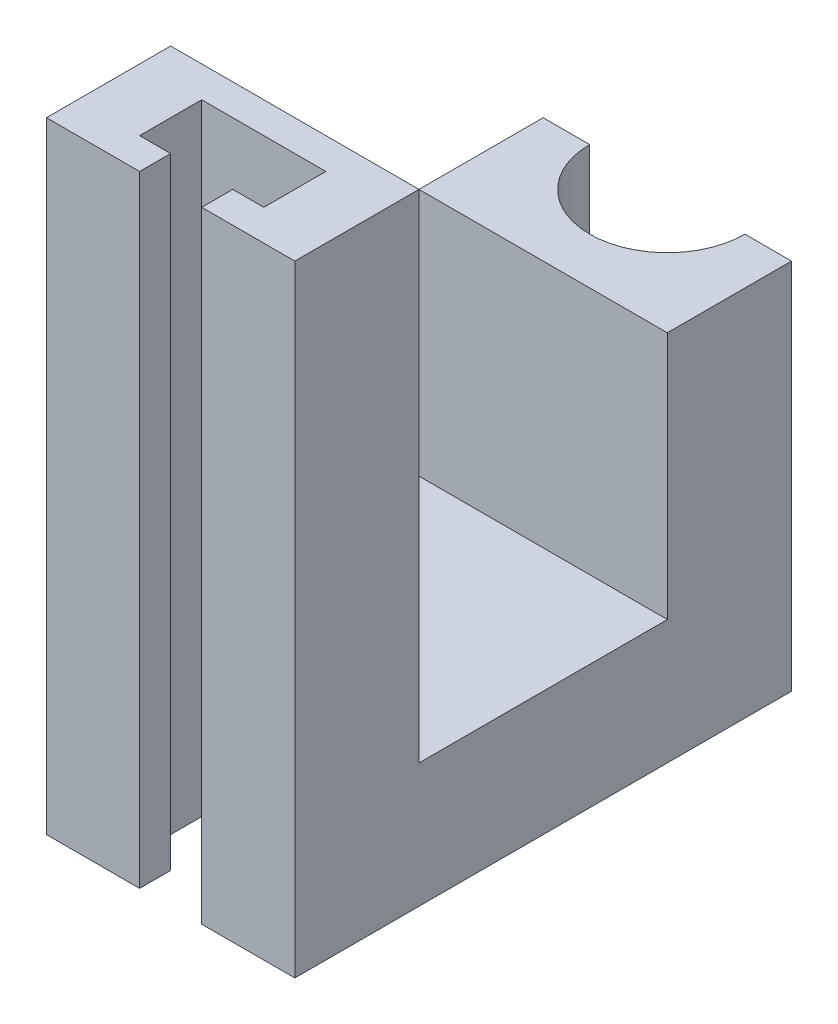
ISO-10303-21;
HEADER;
FILE_DESCRIPTION(('STEP AP214'),'2;1');
FILE_NAME('part.step','',(''),(''),'','','');
FILE_SCHEMA(('AUTOMOTIVE_DESIGN { 1 0 10303 214 1 1 1 1 }'));
ENDSEC;
DATA;
#1=APPLICATION_CONTEXT('core data for automotive mechanical design processes');
#2=APPLICATION_PROTOCOL_DEFINITION('international standard','automotive_design',2000,#1);
#3=PRODUCT_CONTEXT('',#1,'mechanical');
#4=PRODUCT('Part','Part','',(#3));
#5=PRODUCT_RELATED_PRODUCT_CATEGORY('part','',(#4));
#6=PRODUCT_DEFINITION_FORMATION('','',#4);
#7=PRODUCT_DEFINITION_CONTEXT('part definition',#1,'design');
#8=PRODUCT_DEFINITION('design','',#6,#7);
#9=PRODUCT_DEFINITION_SHAPE('','',#8);
#10=(LENGTH_UNIT() NAMED_UNIT(*) SI_UNIT(.MILLI.,.METRE.));
#11=(NAMED_UNIT(*) PLANE_ANGLE_UNIT() SI_UNIT($,.RADIAN.));
#12=(NAMED_UNIT(*) SI_UNIT($,.STERADIAN.) SOLID_ANGLE_UNIT());
#13=UNCERTAINTY_MEASURE_WITH_UNIT(LENGTH_MEASURE(1.E-05),#10,'distance_accuracy_value','');
#14=(GEOMETRIC_REPRESENTATION_CONTEXT(3) GLOBAL_UNCERTAINTY_ASSIGNED_CONTEXT((#13)) GLOBAL_UNIT_ASSIGNED_CONTEXT((#10,
#11,#12)) REPRESENTATION_CONTEXT('',''));
#15=CARTESIAN_POINT('',(0.,0.,0.));
#16=DIRECTION('',(0.,0.,1.));
#17=DIRECTION('',(1.,0.,0.));
#18=AXIS2_PLACEMENT_3D('',#15,#16,#17);
#19=CARTESIAN_POINT('',(0.,100.,0.));
#20=DIRECTION('',(0.,1.,0.));
#21=DIRECTION('',(0.,0.,1.));
#22=AXIS2_PLACEMENT_3D('',#19,#20,#21);
#23=PLANE('',#22);
#24=DIRECTION('',(-1.,0.,0.));
#25=VECTOR('',#24,1.);
#26=CARTESIAN_POINT('',(26.6601873028341,100.,-20.7151911646467));
#27=LINE('',#26,#25);
#28=CARTESIAN_POINT('',(26.6591873028341,100.,-20.7151911646467));
#29=VERTEX_POINT('',#28);
#30=CARTESIAN_POINT('',(-13.3408126971659,100.,-20.7151911646467));
#31=VERTEX_POINT('',#30);
#32=EDGE_CURVE('E286',#29,#31,#27,.T.);
#33=ORIENTED_EDGE('',*,*,#32,.T.);
#34=DIRECTION('',(0.,0.,-1.));
#35=VECTOR('',#34,1.);
#36=CARTESIAN_POINT('',(-13.3408126971659,100.,0.));
#37=LINE('',#36,#35);
#38=CARTESIAN_POINT('',(-13.3408126971659,100.,-0.715191164646745));
#39=VERTEX_POINT('',#38);
#40=EDGE_CURVE('E255',#39,#31,#37,.T.);
#41=ORIENTED_EDGE('',*,*,#40,.F.);
#42=DIRECTION('',(1.,0.,0.));
#43=VECTOR('',#42,1.);
#44=CARTESIAN_POINT('',(0.,100.,-0.715191164646745));
#45=LINE('',#44,#43);
#46=CARTESIAN_POINT('',(1.65918730283408,100.,-0.715191164646745));
#47=VERTEX_POINT('',#46);
#48=EDGE_CURVE('E172',#39,#47,#45,.T.);
#49=ORIENTED_EDGE('',*,*,#48,.T.);
#50=DIRECTION('',(0.,0.,-1.));
#51=VECTOR('',#50,1.);
#52=CARTESIAN_POINT('',(1.65918730283408,100.,0.));
#53=LINE('',#52,#51);
#54=CARTESIAN_POINT('',(1.65918730283408,100.,-5.71519116464675));
#55=VERTEX_POINT('',#54);
#56=EDGE_CURVE('E249',#47,#55,#53,.T.);
#57=ORIENTED_EDGE('',*,*,#56,.T.);
#58=DIRECTION('',(-1.,0.,0.));
#59=VECTOR('',#58,1.);
#60=CARTESIAN_POINT('',(0.,100.,-5.71519116464675));
#61=LINE('',#60,#59);
#62=CARTESIAN_POINT('',(-3.34081269716592,100.,-5.71519116464674));
#63=VERTEX_POINT('',#62);
#64=EDGE_CURVE('E251',#55,#63,#61,.T.);
#65=ORIENTED_EDGE('',*,*,#64,.T.);
#66=DIRECTION('',(0.,0.,-1.));
#67=VECTOR('',#66,1.);
#68=CARTESIAN_POINT('',(-3.34081269716592,100.,0.));
#69=LINE('',#68,#67);
#70=CARTESIAN_POINT('',(-3.34081269716592,100.,-15.7151911646467));
#71=VERTEX_POINT('',#70);
#72=EDGE_CURVE('E253',#63,#71,#69,.T.);
#73=ORIENTED_EDGE('',*,*,#72,.T.);
#74=DIRECTION('',(1.,0.,0.));
#75=VECTOR('',#74,1.);
#76=CARTESIAN_POINT('',(0.,100.,-15.7151911646467));
#77=LINE('',#76,#75);
#78=CARTESIAN_POINT('',(16.6591873028341,100.,-15.7151911646467));
#79=VERTEX_POINT('',#78);
#80=EDGE_CURVE('E259',#71,#79,#77,.T.);
#81=ORIENTED_EDGE('',*,*,#80,.T.);
#82=DIRECTION('',(0.,0.,1.));
#83=VECTOR('',#82,1.);
#84=CARTESIAN_POINT('',(16.6591873028341,100.,0.));
#85=LINE('',#84,#83);
#86=CARTESIAN_POINT('',(16.6591873028341,100.,-5.71519116464674));
#87=VERTEX_POINT('',#86);
#88=EDGE_CURVE('E152',#79,#87,#85,.T.);
#89=ORIENTED_EDGE('',*,*,#88,.T.);
#90=DIRECTION('',(-1.,0.,0.));
#91=VECTOR('',#90,1.);
#92=CARTESIAN_POINT('',(0.,100.,-5.71519116464674));
#93=LINE('',#92,#91);
#94=CARTESIAN_POINT('',(11.6591873028341,100.,-5.71519116464674));
#95=VERTEX_POINT('',#94);
#96=EDGE_CURVE('E145',#87,#95,#93,.T.);
#97=ORIENTED_EDGE('',*,*,#96,.T.);
#98=DIRECTION('',(0.,0.,1.));
#99=VECTOR('',#98,1.);
#100=CARTESIAN_POINT('',(11.6591873028341,100.,0.));
#101=LINE('',#100,#99);
#102=CARTESIAN_POINT('',(11.6591873028341,100.,-0.715191164646745));
#103=VERTEX_POINT('',#102);
#104=EDGE_CURVE('E149',#95,#103,#101,.T.);
#105=ORIENTED_EDGE('',*,*,#104,.T.);
#106=CARTESIAN_POINT('',(26.6591873028341,100.,-0.715191164646745));
#107=VERTEX_POINT('',#106);
#108=EDGE_CURVE('E63',#103,#107,#45,.T.);
#109=ORIENTED_EDGE('',*,*,#108,.T.);
#110=DIRECTION('',(0.,0.,-1.));
#111=VECTOR('',#110,1.);
#112=CARTESIAN_POINT('',(26.6591873028341,100.,0.));
#113=LINE('',#112,#111);
#114=EDGE_CURVE('E170',#107,#29,#113,.T.);
#115=ORIENTED_EDGE('',*,*,#114,.T.);
#116=EDGE_LOOP('',(#33,#41,#49,#57,#65,#73,#81,#89,#97,#105,#109,#115));
#117=FACE_BOUND('',#116,.T.);
#118=ADVANCED_FACE('F39',(#117),#23,.T.);
#119=CARTESIAN_POINT('',(6.65918730283408,100.,-80.7151911646467));
#120=DIRECTION('',(0.,-1.,0.));
#121=DIRECTION('',(0.,0.,-1.));
#122=AXIS2_PLACEMENT_3D('',#119,#120,#121);
#123=CYLINDRICAL_SURFACE('',#122,12.5);
#124=CARTESIAN_POINT('',(6.65918730283408,60.,-80.7151911646467));
#125=DIRECTION('',(0.,-1.,0.));
#126=DIRECTION('',(0.,0.,-1.));
#127=AXIS2_PLACEMENT_3D('',#124,#125,#126);
#128=CIRCLE('',#127,12.5);
#129=CARTESIAN_POINT('',(-5.84081269716591,60.,-80.7151911646467));
#130=VERTEX_POINT('',#129);
#131=CARTESIAN_POINT('',(19.1591873028341,60.,-80.7151911646467));
#132=VERTEX_POINT('',#131);
#133=EDGE_CURVE('E324',#130,#132,#128,.F.);
#134=ORIENTED_EDGE('',*,*,#133,.T.);
#135=DIRECTION('',(0.,-1.,0.));
#136=VECTOR('',#135,1.);
#137=CARTESIAN_POINT('',(19.1591873028341,100.,-80.7151911646467));
#138=LINE('',#137,#136);
#139=CARTESIAN_POINT('',(19.1591873028341,0.,-80.7151911646467));
#140=VERTEX_POINT('',#139);
#141=EDGE_CURVE('E114',#132,#140,#138,.T.);
#142=ORIENTED_EDGE('',*,*,#141,.T.);
#143=CARTESIAN_POINT('',(6.65918730283408,0.,-80.7151911646467));
#144=DIRECTION('',(0.,1.,0.));
#145=DIRECTION('',(0.,0.,1.));
#146=AXIS2_PLACEMENT_3D('',#143,#144,#145);
#147=CIRCLE('',#146,12.5);
#148=CARTESIAN_POINT('',(-5.84081269716591,0.,-80.7151911646467));
#149=VERTEX_POINT('',#148);
#150=EDGE_CURVE('E176',#149,#140,#147,.T.);
#151=ORIENTED_EDGE('',*,*,#150,.F.);
#152=DIRECTION('',(0.,-1.,0.));
#153=VECTOR('',#152,1.);
#154=CARTESIAN_POINT('',(-5.84081269716591,100.,-80.7151911646467));
#155=LINE('',#154,#153);
#156=EDGE_CURVE('E11',#130,#149,#155,.T.);
#157=ORIENTED_EDGE('',*,*,#156,.F.);
#158=EDGE_LOOP('',(#134,#142,#151,#157));
#159=FACE_BOUND('',#158,.T.);
#160=ADVANCED_FACE('F41',(#159),#123,.F.);
#161=CARTESIAN_POINT('',(0.,100.,-80.7151911646467));
#162=DIRECTION('',(0.,0.,-1.));
#163=DIRECTION('',(-1.,0.,0.));
#164=AXIS2_PLACEMENT_3D('',#161,#162,#163);
#165=PLANE('',#164);
#166=DIRECTION('',(-1.,0.,0.));
#167=VECTOR('',#166,1.);
#168=CARTESIAN_POINT('',(26.6601873028341,60.,-80.7151911646467));
#169=LINE('',#168,#167);
#170=CARTESIAN_POINT('',(-13.3408126971659,60.,-80.7151911646467));
#171=VERTEX_POINT('',#170);
#172=EDGE_CURVE('E350',#130,#171,#169,.T.);
#173=ORIENTED_EDGE('',*,*,#172,.F.);
#174=ORIENTED_EDGE('',*,*,#156,.T.);
#175=DIRECTION('',(1.,0.,0.));
#176=VECTOR('',#175,1.);
#177=CARTESIAN_POINT('',(0.,0.,-80.7151911646467));
#178=LINE('',#177,#176);
#179=CARTESIAN_POINT('',(-13.3408126971659,0.,-80.7151911646467));
#180=VERTEX_POINT('',#179);
#181=EDGE_CURVE('E178',#180,#149,#178,.T.);
#182=ORIENTED_EDGE('',*,*,#181,.F.);
#183=DIRECTION('',(0.,-1.,0.));
#184=VECTOR('',#183,1.);
#185=CARTESIAN_POINT('',(-13.3408126971659,100.,-80.7151911646467));
#186=LINE('',#185,#184);
#187=EDGE_CURVE('E47',#171,#180,#186,.T.);
#188=ORIENTED_EDGE('',*,*,#187,.F.);
#189=EDGE_LOOP('',(#173,#174,#182,#188));
#190=FACE_BOUND('',#189,.T.);
#191=ADVANCED_FACE('F235',(#190),#165,.T.);
#192=CARTESIAN_POINT('',(-13.3408126971659,100.,0.));
#193=DIRECTION('',(-1.,0.,0.));
#194=DIRECTION('',(0.,0.,1.));
#195=AXIS2_PLACEMENT_3D('',#192,#193,#194);
#196=PLANE('',#195);
#197=DIRECTION('',(0.,0.,1.));
#198=VECTOR('',#197,1.);
#199=CARTESIAN_POINT('',(-13.3408126971659,60.,0.));
#200=LINE('',#199,#198);
#201=CARTESIAN_POINT('',(-13.3408126971659,60.,-60.7151911646468));
#202=VERTEX_POINT('',#201);
#203=EDGE_CURVE('E54',#171,#202,#200,.T.);
#204=ORIENTED_EDGE('',*,*,#203,.F.);
#205=ORIENTED_EDGE('',*,*,#187,.T.);
#206=DIRECTION('',(0.,0.,-1.));
#207=VECTOR('',#206,1.);
#208=CARTESIAN_POINT('',(-13.3408126971659,0.,0.));
#209=LINE('',#208,#207);
#210=CARTESIAN_POINT('',(-13.3408126971659,0.,-0.715191164646745));
#211=VERTEX_POINT('',#210);
#212=EDGE_CURVE('E182',#211,#180,#209,.T.);
#213=ORIENTED_EDGE('',*,*,#212,.F.);
#214=DIRECTION('',(0.,-1.,0.));
#215=VECTOR('',#214,1.);
#216=CARTESIAN_POINT('',(-13.3408126971659,100.,-0.715191164646745));
#217=LINE('',#216,#215);
#218=EDGE_CURVE('E122',#39,#211,#217,.T.);
#219=ORIENTED_EDGE('',*,*,#218,.F.);
#220=ORIENTED_EDGE('',*,*,#40,.T.);
#221=DIRECTION('',(0.,1.,0.));
#222=VECTOR('',#221,1.);
#223=CARTESIAN_POINT('',(-13.3408126971659,20.,-20.7151911646467));
#224=LINE('',#223,#222);
#225=CARTESIAN_POINT('',(-13.3408126971659,20.,-20.7151911646467));
#226=VERTEX_POINT('',#225);
#227=EDGE_CURVE('E319',#226,#31,#224,.T.);
#228=ORIENTED_EDGE('',*,*,#227,.F.);
#229=DIRECTION('',(0.,0.,1.));
#230=VECTOR('',#229,1.);
#231=CARTESIAN_POINT('',(-13.3408126971659,20.,-60.7151911646467));
#232=LINE('',#231,#230);
#233=CARTESIAN_POINT('',(-13.3408126971659,20.,-60.7151911646467));
#234=VERTEX_POINT('',#233);
#235=EDGE_CURVE('E315',#234,#226,#232,.T.);
#236=ORIENTED_EDGE('',*,*,#235,.F.);
#237=DIRECTION('',(0.,-1.,0.));
#238=VECTOR('',#237,1.);
#239=CARTESIAN_POINT('',(-13.3408126971659,100.,-60.7151911646468));
#240=LINE('',#239,#238);
#241=EDGE_CURVE('E329',#202,#234,#240,.T.);
#242=ORIENTED_EDGE('',*,*,#241,.F.);
#243=EDGE_LOOP('',(#204,#205,#213,#219,#220,#228,#236,#242));
#244=FACE_BOUND('',#243,.T.);
#245=ADVANCED_FACE('F230',(#244),#196,.T.);
#246=CARTESIAN_POINT('',(0.,100.,-0.715191164646745));
#247=DIRECTION('',(0.,0.,-1.));
#248=DIRECTION('',(-1.,0.,0.));
#249=AXIS2_PLACEMENT_3D('',#246,#247,#248);
#250=PLANE('',#249);
#251=DIRECTION('',(1.,0.,0.));
#252=VECTOR('',#251,1.);
#253=CARTESIAN_POINT('',(0.,0.,-0.715191164646745));
#254=LINE('',#253,#252);
#255=CARTESIAN_POINT('',(1.65918730283408,0.,-0.715191164646745));
#256=VERTEX_POINT('',#255);
#257=EDGE_CURVE('E186',#211,#256,#254,.T.);
#258=ORIENTED_EDGE('',*,*,#257,.T.);
#259=DIRECTION('',(0.,-1.,0.));
#260=VECTOR('',#259,1.);
#261=CARTESIAN_POINT('',(1.65918730283408,100.,-0.715191164646745));
#262=LINE('',#261,#260);
#263=EDGE_CURVE('E225',#47,#256,#262,.T.);
#264=ORIENTED_EDGE('',*,*,#263,.F.);
#265=ORIENTED_EDGE('',*,*,#48,.F.);
#266=ORIENTED_EDGE('',*,*,#218,.T.);
#267=EDGE_LOOP('',(#258,#264,#265,#266));
#268=FACE_BOUND('',#267,.T.);
#269=ADVANCED_FACE('F244',(#268),#250,.F.);
#270=CARTESIAN_POINT('',(1.65918730283408,100.,0.));
#271=DIRECTION('',(-1.,0.,0.));
#272=DIRECTION('',(0.,0.,1.));
#273=AXIS2_PLACEMENT_3D('',#270,#271,#272);
#274=PLANE('',#273);
#275=DIRECTION('',(0.,0.,-1.));
#276=VECTOR('',#275,1.);
#277=CARTESIAN_POINT('',(1.65918730283408,0.,0.));
#278=LINE('',#277,#276);
#279=CARTESIAN_POINT('',(1.65918730283408,0.,-5.71519116464675));
#280=VERTEX_POINT('',#279);
#281=EDGE_CURVE('E188',#256,#280,#278,.T.);
#282=ORIENTED_EDGE('',*,*,#281,.T.);
#283=DIRECTION('',(0.,-1.,0.));
#284=VECTOR('',#283,1.);
#285=CARTESIAN_POINT('',(1.65918730283408,100.,-5.71519116464675));
#286=LINE('',#285,#284);
#287=EDGE_CURVE('E222',#55,#280,#286,.T.);
#288=ORIENTED_EDGE('',*,*,#287,.F.);
#289=ORIENTED_EDGE('',*,*,#56,.F.);
#290=ORIENTED_EDGE('',*,*,#263,.T.);
#291=EDGE_LOOP('',(#282,#288,#289,#290));
#292=FACE_BOUND('',#291,.T.);
#293=ADVANCED_FACE('F247',(#292),#274,.F.);
#294=CARTESIAN_POINT('',(0.,100.,-5.71519116464675));
#295=DIRECTION('',(0.,0.,1.));
#296=DIRECTION('',(1.,0.,0.));
#297=AXIS2_PLACEMENT_3D('',#294,#295,#296);
#298=PLANE('',#297);
#299=DIRECTION('',(-1.,0.,0.));
#300=VECTOR('',#299,1.);
#301=CARTESIAN_POINT('',(0.,0.,-5.71519116464675));
#302=LINE('',#301,#300);
#303=CARTESIAN_POINT('',(-3.34081269716592,0.,-5.71519116464674));
#304=VERTEX_POINT('',#303);
#305=EDGE_CURVE('E191',#280,#304,#302,.T.);
#306=ORIENTED_EDGE('',*,*,#305,.T.);
#307=DIRECTION('',(0.,-1.,0.));
#308=VECTOR('',#307,1.);
#309=CARTESIAN_POINT('',(-3.34081269716592,100.,-5.71519116464674));
#310=LINE('',#309,#308);
#311=EDGE_CURVE('E219',#63,#304,#310,.T.);
#312=ORIENTED_EDGE('',*,*,#311,.F.);
#313=ORIENTED_EDGE('',*,*,#64,.F.);
#314=ORIENTED_EDGE('',*,*,#287,.T.);
#315=EDGE_LOOP('',(#306,#312,#313,#314));
#316=FACE_BOUND('',#315,.T.);
#317=ADVANCED_FACE('F390',(#316),#298,.F.);
#318=CARTESIAN_POINT('',(-3.34081269716592,100.,0.));
#319=DIRECTION('',(-1.,0.,0.));
#320=DIRECTION('',(0.,0.,1.));
#321=AXIS2_PLACEMENT_3D('',#318,#319,#320);
#322=PLANE('',#321);
#323=DIRECTION('',(0.,0.,-1.));
#324=VECTOR('',#323,1.);
#325=CARTESIAN_POINT('',(-3.34081269716592,0.,0.));
#326=LINE('',#325,#324);
#327=CARTESIAN_POINT('',(-3.34081269716592,0.,-15.7151911646467));
#328=VERTEX_POINT('',#327);
#329=EDGE_CURVE('E193',#304,#328,#326,.T.);
#330=ORIENTED_EDGE('',*,*,#329,.T.);
#331=DIRECTION('',(0.,-1.,0.));
#332=VECTOR('',#331,1.);
#333=CARTESIAN_POINT('',(-3.34081269716592,100.,-15.7151911646467));
#334=LINE('',#333,#332);
#335=EDGE_CURVE('E216',#71,#328,#334,.T.);
#336=ORIENTED_EDGE('',*,*,#335,.F.);
#337=ORIENTED_EDGE('',*,*,#72,.F.);
#338=ORIENTED_EDGE('',*,*,#311,.T.);
#339=EDGE_LOOP('',(#330,#336,#337,#338));
#340=FACE_BOUND('',#339,.T.);
#341=ADVANCED_FACE('F387',(#340),#322,.F.);
#342=CARTESIAN_POINT('',(0.,100.,-15.7151911646467));
#343=DIRECTION('',(0.,0.,-1.));
#344=DIRECTION('',(-1.,0.,0.));
#345=AXIS2_PLACEMENT_3D('',#342,#343,#344);
#346=PLANE('',#345);
#347=DIRECTION('',(1.,0.,0.));
#348=VECTOR('',#347,1.);
#349=CARTESIAN_POINT('',(0.,0.,-15.7151911646467));
#350=LINE('',#349,#348);
#351=CARTESIAN_POINT('',(16.6591873028341,0.,-15.7151911646467));
#352=VERTEX_POINT('',#351);
#353=EDGE_CURVE('E195',#328,#352,#350,.T.);
#354=ORIENTED_EDGE('',*,*,#353,.T.);
#355=DIRECTION('',(0.,-1.,0.));
#356=VECTOR('',#355,1.);
#357=CARTESIAN_POINT('',(16.6591873028341,100.,-15.7151911646467));
#358=LINE('',#357,#356);
#359=EDGE_CURVE('E213',#79,#352,#358,.T.);
#360=ORIENTED_EDGE('',*,*,#359,.F.);
#361=ORIENTED_EDGE('',*,*,#80,.F.);
#362=ORIENTED_EDGE('',*,*,#335,.T.);
#363=EDGE_LOOP('',(#354,#360,#361,#362));
#364=FACE_BOUND('',#363,.T.);
#365=ADVANCED_FACE('F265',(#364),#346,.F.);
#366=CARTESIAN_POINT('',(16.6591873028341,100.,0.));
#367=DIRECTION('',(1.,0.,0.));
#368=DIRECTION('',(0.,0.,-1.));
#369=AXIS2_PLACEMENT_3D('',#366,#367,#368);
#370=PLANE('',#369);
#371=DIRECTION('',(0.,0.,1.));
#372=VECTOR('',#371,1.);
#373=CARTESIAN_POINT('',(16.6591873028341,0.,0.));
#374=LINE('',#373,#372);
#375=CARTESIAN_POINT('',(16.6591873028341,0.,-5.71519116464674));
#376=VERTEX_POINT('',#375);
#377=EDGE_CURVE('E197',#352,#376,#374,.T.);
#378=ORIENTED_EDGE('',*,*,#377,.T.);
#379=DIRECTION('',(0.,-1.,0.));
#380=VECTOR('',#379,1.);
#381=CARTESIAN_POINT('',(16.6591873028341,100.,-5.71519116464674));
#382=LINE('',#381,#380);
#383=EDGE_CURVE('E164',#87,#376,#382,.T.);
#384=ORIENTED_EDGE('',*,*,#383,.F.);
#385=ORIENTED_EDGE('',*,*,#88,.F.);
#386=ORIENTED_EDGE('',*,*,#359,.T.);
#387=EDGE_LOOP('',(#378,#384,#385,#386));
#388=FACE_BOUND('',#387,.T.);
#389=ADVANCED_FACE('F269',(#388),#370,.F.);
#390=CARTESIAN_POINT('',(0.,100.,-5.71519116464674));
#391=DIRECTION('',(0.,0.,1.));
#392=DIRECTION('',(1.,0.,0.));
#393=AXIS2_PLACEMENT_3D('',#390,#391,#392);
#394=PLANE('',#393);
#395=DIRECTION('',(-1.,0.,0.));
#396=VECTOR('',#395,1.);
#397=CARTESIAN_POINT('',(0.,0.,-5.71519116464674));
#398=LINE('',#397,#396);
#399=CARTESIAN_POINT('',(11.6591873028341,0.,-5.71519116464674));
#400=VERTEX_POINT('',#399);
#401=EDGE_CURVE('E161',#376,#400,#398,.T.);
#402=ORIENTED_EDGE('',*,*,#401,.T.);
#403=DIRECTION('',(0.,-1.,0.));
#404=VECTOR('',#403,1.);
#405=CARTESIAN_POINT('',(11.6591873028341,100.,-5.71519116464674));
#406=LINE('',#405,#404);
#407=EDGE_CURVE('E158',#95,#400,#406,.T.);
#408=ORIENTED_EDGE('',*,*,#407,.F.);
#409=ORIENTED_EDGE('',*,*,#96,.F.);
#410=ORIENTED_EDGE('',*,*,#383,.T.);
#411=EDGE_LOOP('',(#402,#408,#409,#410));
#412=FACE_BOUND('',#411,.T.);
#413=ADVANCED_FACE('F159',(#412),#394,.F.);
#414=CARTESIAN_POINT('',(11.6591873028341,100.,0.));
#415=DIRECTION('',(1.,0.,0.));
#416=DIRECTION('',(0.,0.,-1.));
#417=AXIS2_PLACEMENT_3D('',#414,#415,#416);
#418=PLANE('',#417);
#419=DIRECTION('',(0.,0.,1.));
#420=VECTOR('',#419,1.);
#421=CARTESIAN_POINT('',(11.6591873028341,0.,0.));
#422=LINE('',#421,#420);
#423=CARTESIAN_POINT('',(11.6591873028341,0.,-0.715191164646745));
#424=VERTEX_POINT('',#423);
#425=EDGE_CURVE('E200',#400,#424,#422,.T.);
#426=ORIENTED_EDGE('',*,*,#425,.T.);
#427=DIRECTION('',(0.,-1.,0.));
#428=VECTOR('',#427,1.);
#429=CARTESIAN_POINT('',(11.6591873028341,100.,-0.715191164646745));
#430=LINE('',#429,#428);
#431=EDGE_CURVE('E165',#103,#424,#430,.T.);
#432=ORIENTED_EDGE('',*,*,#431,.F.);
#433=ORIENTED_EDGE('',*,*,#104,.F.);
#434=ORIENTED_EDGE('',*,*,#407,.T.);
#435=EDGE_LOOP('',(#426,#432,#433,#434));
#436=FACE_BOUND('',#435,.T.);
#437=ADVANCED_FACE('F167',(#436),#418,.F.);
#438=CARTESIAN_POINT('',(26.6591873028341,0.,-0.715191164646745));
#439=VERTEX_POINT('',#438);
#440=EDGE_CURVE('E189',#424,#439,#254,.T.);
#441=ORIENTED_EDGE('',*,*,#440,.T.);
#442=DIRECTION('',(0.,-1.,0.));
#443=VECTOR('',#442,1.);
#444=CARTESIAN_POINT('',(26.6591873028341,100.,-0.715191164646745));
#445=LINE('',#444,#443);
#446=EDGE_CURVE('E208',#107,#439,#445,.T.);
#447=ORIENTED_EDGE('',*,*,#446,.F.);
#448=ORIENTED_EDGE('',*,*,#108,.F.);
#449=ORIENTED_EDGE('',*,*,#431,.T.);
#450=EDGE_LOOP('',(#441,#447,#448,#449));
#451=FACE_BOUND('',#450,.T.);
#452=ADVANCED_FACE('F273',(#451),#250,.F.);
#453=CARTESIAN_POINT('',(26.6591873028341,100.,0.));
#454=DIRECTION('',(-1.,0.,0.));
#455=DIRECTION('',(0.,0.,1.));
#456=AXIS2_PLACEMENT_3D('',#453,#454,#455);
#457=PLANE('',#456);
#458=DIRECTION('',(0.,-1.,0.));
#459=VECTOR('',#458,1.);
#460=CARTESIAN_POINT('',(26.6591873028341,100.,-80.7151911646467));
#461=LINE('',#460,#459);
#462=CARTESIAN_POINT('',(26.6591873028341,60.,-80.7151911646467));
#463=VERTEX_POINT('',#462);
#464=CARTESIAN_POINT('',(26.6591873028341,0.,-80.7151911646467));
#465=VERTEX_POINT('',#464);
#466=EDGE_CURVE('E206',#463,#465,#461,.T.);
#467=ORIENTED_EDGE('',*,*,#466,.F.);
#468=DIRECTION('',(0.,0.,-1.));
#469=VECTOR('',#468,1.);
#470=CARTESIAN_POINT('',(26.6591873028341,60.,0.));
#471=LINE('',#470,#469);
#472=CARTESIAN_POINT('',(26.6591873028341,60.,-60.7151911646468));
#473=VERTEX_POINT('',#472);
#474=EDGE_CURVE('E342',#473,#463,#471,.T.);
#475=ORIENTED_EDGE('',*,*,#474,.F.);
#476=DIRECTION('',(0.,1.,0.));
#477=VECTOR('',#476,1.);
#478=CARTESIAN_POINT('',(26.6591873028341,100.,-60.7151911646468));
#479=LINE('',#478,#477);
#480=CARTESIAN_POINT('',(26.6591873028341,20.,-60.7151911646467));
#481=VERTEX_POINT('',#480);
#482=EDGE_CURVE('E322',#481,#473,#479,.T.);
#483=ORIENTED_EDGE('',*,*,#482,.F.);
#484=DIRECTION('',(0.,0.,-1.));
#485=VECTOR('',#484,1.);
#486=CARTESIAN_POINT('',(26.6591873028341,20.,-60.7151911646467));
#487=LINE('',#486,#485);
#488=CARTESIAN_POINT('',(26.6591873028341,20.,-20.7151911646467));
#489=VERTEX_POINT('',#488);
#490=EDGE_CURVE('E312',#489,#481,#487,.T.);
#491=ORIENTED_EDGE('',*,*,#490,.F.);
#492=DIRECTION('',(0.,-1.,0.));
#493=VECTOR('',#492,1.);
#494=CARTESIAN_POINT('',(26.6591873028341,20.,-20.7151911646467));
#495=LINE('',#494,#493);
#496=EDGE_CURVE('E282',#29,#489,#495,.T.);
#497=ORIENTED_EDGE('',*,*,#496,.F.);
#498=ORIENTED_EDGE('',*,*,#114,.F.);
#499=ORIENTED_EDGE('',*,*,#446,.T.);
#500=DIRECTION('',(0.,0.,-1.));
#501=VECTOR('',#500,1.);
#502=CARTESIAN_POINT('',(26.6591873028341,0.,0.));
#503=LINE('',#502,#501);
#504=EDGE_CURVE('E202',#439,#465,#503,.T.);
#505=ORIENTED_EDGE('',*,*,#504,.T.);
#506=EDGE_LOOP('',(#467,#475,#483,#491,#497,#498,#499,#505));
#507=FACE_BOUND('',#506,.T.);
#508=ADVANCED_FACE('F278',(#507),#457,.F.);
#509=EDGE_CURVE('E340',#463,#132,#169,.T.);
#510=ORIENTED_EDGE('',*,*,#509,.F.);
#511=ORIENTED_EDGE('',*,*,#466,.T.);
#512=EDGE_CURVE('E183',#140,#465,#178,.T.);
#513=ORIENTED_EDGE('',*,*,#512,.F.);
#514=ORIENTED_EDGE('',*,*,#141,.F.);
#515=EDGE_LOOP('',(#510,#511,#513,#514));
#516=FACE_BOUND('',#515,.T.);
#517=ADVANCED_FACE('F337',(#516),#165,.T.);
#518=CARTESIAN_POINT('',(0.,0.,0.));
#519=DIRECTION('',(0.,1.,0.));
#520=DIRECTION('',(0.,0.,1.));
#521=AXIS2_PLACEMENT_3D('',#518,#519,#520);
#522=PLANE('',#521);
#523=ORIENTED_EDGE('',*,*,#150,.T.);
#524=ORIENTED_EDGE('',*,*,#512,.T.);
#525=ORIENTED_EDGE('',*,*,#504,.F.);
#526=ORIENTED_EDGE('',*,*,#440,.F.);
#527=ORIENTED_EDGE('',*,*,#425,.F.);
#528=ORIENTED_EDGE('',*,*,#401,.F.);
#529=ORIENTED_EDGE('',*,*,#377,.F.);
#530=ORIENTED_EDGE('',*,*,#353,.F.);
#531=ORIENTED_EDGE('',*,*,#329,.F.);
#532=ORIENTED_EDGE('',*,*,#305,.F.);
#533=ORIENTED_EDGE('',*,*,#281,.F.);
#534=ORIENTED_EDGE('',*,*,#257,.F.);
#535=ORIENTED_EDGE('',*,*,#212,.T.);
#536=ORIENTED_EDGE('',*,*,#181,.T.);
#537=EDGE_LOOP('',(#523,#524,#525,#526,#527,#528,#529,#530,#531,#532,#533,#534,#535,#536));
#538=FACE_BOUND('',#537,.T.);
#539=ADVANCED_FACE('F239',(#538),#522,.F.);
#540=CARTESIAN_POINT('',(26.6601873028341,20.,-20.7151911646467));
#541=DIRECTION('',(0.,0.,1.));
#542=DIRECTION('',(0.,-1.,0.));
#543=AXIS2_PLACEMENT_3D('',#540,#541,#542);
#544=PLANE('',#543);
#545=ORIENTED_EDGE('',*,*,#496,.T.);
#546=DIRECTION('',(-1.,0.,0.));
#547=VECTOR('',#546,1.);
#548=CARTESIAN_POINT('',(26.6601873028341,20.,-20.7151911646467));
#549=LINE('',#548,#547);
#550=EDGE_CURVE('E179',#489,#226,#549,.T.);
#551=ORIENTED_EDGE('',*,*,#550,.T.);
#552=ORIENTED_EDGE('',*,*,#227,.T.);
#553=ORIENTED_EDGE('',*,*,#32,.F.);
#554=EDGE_LOOP('',(#545,#551,#552,#553));
#555=FACE_BOUND('',#554,.T.);
#556=ADVANCED_FACE('F318',(#555),#544,.F.);
#557=CARTESIAN_POINT('',(26.6601873028341,20.,-60.7151911646467));
#558=DIRECTION('',(0.,-1.,0.));
#559=DIRECTION('',(0.,0.,-1.));
#560=AXIS2_PLACEMENT_3D('',#557,#558,#559);
#561=PLANE('',#560);
#562=ORIENTED_EDGE('',*,*,#490,.T.);
#563=DIRECTION('',(-1.,0.,0.));
#564=VECTOR('',#563,1.);
#565=CARTESIAN_POINT('',(26.6601873028341,20.,-60.7151911646467));
#566=LINE('',#565,#564);
#567=EDGE_CURVE('E306',#481,#234,#566,.T.);
#568=ORIENTED_EDGE('',*,*,#567,.T.);
#569=ORIENTED_EDGE('',*,*,#235,.T.);
#570=ORIENTED_EDGE('',*,*,#550,.F.);
#571=EDGE_LOOP('',(#562,#568,#569,#570));
#572=FACE_BOUND('',#571,.T.);
#573=ADVANCED_FACE('F311',(#572),#561,.F.);
#574=CARTESIAN_POINT('',(26.6601873028341,100.,-60.7151911646468));
#575=DIRECTION('',(0.,0.,-1.));
#576=DIRECTION('',(0.,1.,0.));
#577=AXIS2_PLACEMENT_3D('',#574,#575,#576);
#578=PLANE('',#577);
#579=ORIENTED_EDGE('',*,*,#482,.T.);
#580=DIRECTION('',(-1.,0.,0.));
#581=VECTOR('',#580,1.);
#582=CARTESIAN_POINT('',(26.6601873028341,60.,-60.7151911646468));
#583=LINE('',#582,#581);
#584=EDGE_CURVE('E349',#473,#202,#583,.T.);
#585=ORIENTED_EDGE('',*,*,#584,.T.);
#586=ORIENTED_EDGE('',*,*,#241,.T.);
#587=ORIENTED_EDGE('',*,*,#567,.F.);
#588=EDGE_LOOP('',(#579,#585,#586,#587));
#589=FACE_BOUND('',#588,.T.);
#590=ADVANCED_FACE('F355',(#589),#578,.F.);
#591=CARTESIAN_POINT('',(26.6601873028341,60.,0.));
#592=DIRECTION('',(0.,-1.,0.));
#593=DIRECTION('',(0.,0.,-1.));
#594=AXIS2_PLACEMENT_3D('',#591,#592,#593);
#595=PLANE('',#594);
#596=ORIENTED_EDGE('',*,*,#172,.T.);
#597=ORIENTED_EDGE('',*,*,#203,.T.);
#598=ORIENTED_EDGE('',*,*,#584,.F.);
#599=ORIENTED_EDGE('',*,*,#474,.T.);
#600=ORIENTED_EDGE('',*,*,#509,.T.);
#601=ORIENTED_EDGE('',*,*,#133,.F.);
#602=EDGE_LOOP('',(#596,#597,#598,#599,#600,#601));
#603=FACE_BOUND('',#602,.T.);
#604=ADVANCED_FACE('F348',(#603),#595,.F.);
#605=CLOSED_SHELL('',(#118,#160,#191,#245,#269,#293,#317,#341,#365,#389,#413,#437,#452,#508,
#517,#539,#556,#573,#590,#604));
#606=MANIFOLD_SOLID_BREP('B2',#605);
#607=ADVANCED_BREP_SHAPE_REPRESENTATION('',(#18,#606),#14);
#608=SHAPE_DEFINITION_REPRESENTATION(#9,#607);
ENDSEC;
END-ISO-10303-21;
